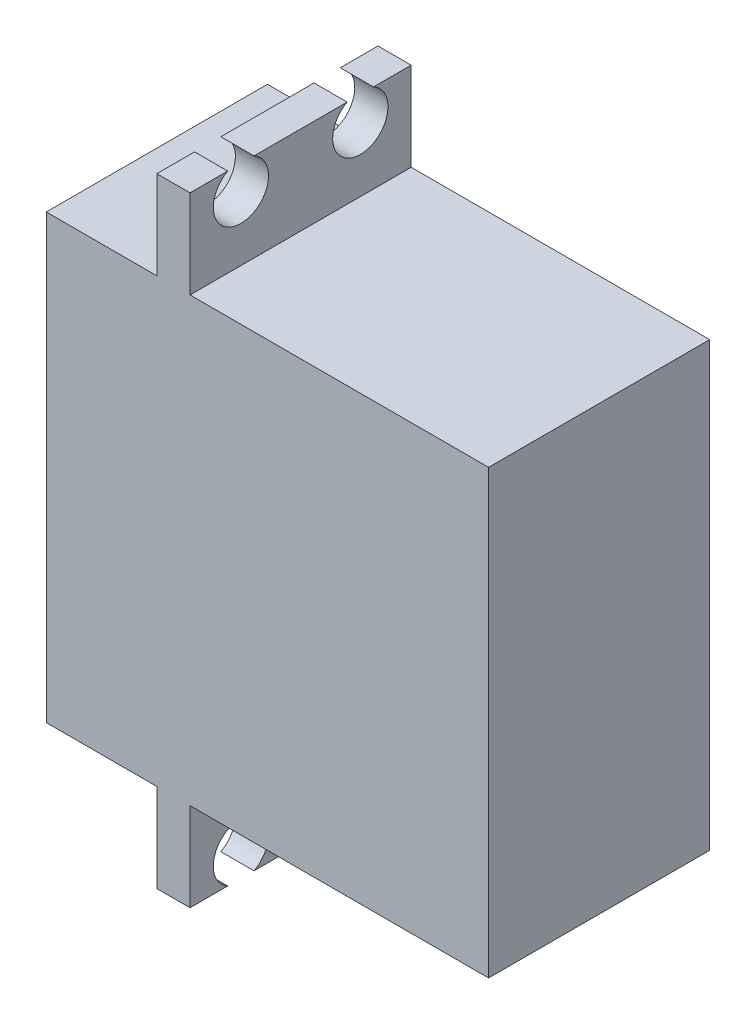
ISO-10303-21;
HEADER;
FILE_DESCRIPTION(('STEP AP214'),'2;1');
FILE_NAME('part.step','',(''),(''),'','','');
FILE_SCHEMA(('AUTOMOTIVE_DESIGN { 1 0 10303 214 1 1 1 1 }'));
ENDSEC;
DATA;
#1=APPLICATION_CONTEXT('core data for automotive mechanical design processes');
#2=APPLICATION_PROTOCOL_DEFINITION('international standard','automotive_design',2000,#1);
#3=PRODUCT_CONTEXT('',#1,'mechanical');
#4=PRODUCT('Part','Part','',(#3));
#5=PRODUCT_RELATED_PRODUCT_CATEGORY('part','',(#4));
#6=PRODUCT_DEFINITION_FORMATION('','',#4);
#7=PRODUCT_DEFINITION_CONTEXT('part definition',#1,'design');
#8=PRODUCT_DEFINITION('design','',#6,#7);
#9=PRODUCT_DEFINITION_SHAPE('','',#8);
#10=(LENGTH_UNIT() NAMED_UNIT(*) SI_UNIT(.MILLI.,.METRE.));
#11=(NAMED_UNIT(*) PLANE_ANGLE_UNIT() SI_UNIT($,.RADIAN.));
#12=(NAMED_UNIT(*) SI_UNIT($,.STERADIAN.) SOLID_ANGLE_UNIT());
#13=UNCERTAINTY_MEASURE_WITH_UNIT(LENGTH_MEASURE(1.E-05),#10,'distance_accuracy_value','');
#14=(GEOMETRIC_REPRESENTATION_CONTEXT(3) GLOBAL_UNCERTAINTY_ASSIGNED_CONTEXT((#13)) GLOBAL_UNIT_ASSIGNED_CONTEXT((#10,
#11,#12)) REPRESENTATION_CONTEXT('',''));
#15=CARTESIAN_POINT('',(0.,0.,0.));
#16=DIRECTION('',(0.,0.,1.));
#17=DIRECTION('',(1.,0.,0.));
#18=AXIS2_PLACEMENT_3D('',#15,#16,#17);
#19=CARTESIAN_POINT('',(0.,28.,0.));
#20=DIRECTION('',(0.,1.,0.));
#21=DIRECTION('',(0.,0.,1.));
#22=AXIS2_PLACEMENT_3D('',#19,#20,#21);
#23=PLANE('',#22);
#24=DIRECTION('',(-1.,0.,0.));
#25=VECTOR('',#24,1.);
#26=CARTESIAN_POINT('',(-2.,28.,3.41256579129621));
#27=LINE('',#26,#25);
#28=CARTESIAN_POINT('',(-7.,28.,3.41256579129621));
#29=VERTEX_POINT('',#28);
#30=CARTESIAN_POINT('',(-10.,28.,3.41256579129621));
#31=VERTEX_POINT('',#30);
#32=EDGE_CURVE('E42',#29,#31,#27,.T.);
#33=ORIENTED_EDGE('',*,*,#32,.F.);
#34=DIRECTION('',(0.,0.,-1.));
#35=VECTOR('',#34,1.);
#36=CARTESIAN_POINT('',(-7.,28.,0.));
#37=LINE('',#36,#35);
#38=CARTESIAN_POINT('',(-7.,28.,0.));
#39=VERTEX_POINT('',#38);
#40=EDGE_CURVE('E200',#29,#39,#37,.T.);
#41=ORIENTED_EDGE('',*,*,#40,.T.);
#42=DIRECTION('',(-1.,0.,0.));
#43=VECTOR('',#42,1.);
#44=CARTESIAN_POINT('',(-10.,28.,0.));
#45=LINE('',#44,#43);
#46=CARTESIAN_POINT('',(-10.,28.,0.));
#47=VERTEX_POINT('',#46);
#48=EDGE_CURVE('E204',#39,#47,#45,.T.);
#49=ORIENTED_EDGE('',*,*,#48,.T.);
#50=DIRECTION('',(0.,0.,1.));
#51=VECTOR('',#50,1.);
#52=CARTESIAN_POINT('',(-10.,28.,0.));
#53=LINE('',#52,#51);
#54=EDGE_CURVE('E190',#47,#31,#53,.T.);
#55=ORIENTED_EDGE('',*,*,#54,.T.);
#56=EDGE_LOOP('',(#33,#41,#49,#55));
#57=FACE_BOUND('',#56,.T.);
#58=ADVANCED_FACE('F34',(#57),#23,.T.);
#59=DIRECTION('',(-1.,0.,0.));
#60=VECTOR('',#59,1.);
#61=CARTESIAN_POINT('',(-2.,28.,5.78743420870379));
#62=LINE('',#61,#60);
#63=CARTESIAN_POINT('',(-10.,28.,5.78743420870379));
#64=VERTEX_POINT('',#63);
#65=CARTESIAN_POINT('',(-6.99999999999999,28.,5.78743420870379));
#66=VERTEX_POINT('',#65);
#67=EDGE_CURVE('E177',#64,#66,#62,.F.);
#68=ORIENTED_EDGE('',*,*,#67,.F.);
#69=CARTESIAN_POINT('',(-10.,28.,14.2125657912962));
#70=VERTEX_POINT('',#69);
#71=EDGE_CURVE('E184',#64,#70,#53,.T.);
#72=ORIENTED_EDGE('',*,*,#71,.T.);
#73=DIRECTION('',(-1.,0.,0.));
#74=VECTOR('',#73,1.);
#75=CARTESIAN_POINT('',(-2.,28.,14.2125657912962));
#76=LINE('',#75,#74);
#77=CARTESIAN_POINT('',(-7.,28.,14.2125657912962));
#78=VERTEX_POINT('',#77);
#79=EDGE_CURVE('E169',#78,#70,#76,.T.);
#80=ORIENTED_EDGE('',*,*,#79,.F.);
#81=EDGE_CURVE('E205',#78,#66,#37,.T.);
#82=ORIENTED_EDGE('',*,*,#81,.T.);
#83=EDGE_LOOP('',(#68,#72,#80,#82));
#84=FACE_BOUND('',#83,.T.);
#85=ADVANCED_FACE('F189',(#84),#23,.T.);
#86=CARTESIAN_POINT('',(0.,-28.,0.));
#87=DIRECTION('',(0.,-1.,0.));
#88=DIRECTION('',(0.,0.,-1.));
#89=AXIS2_PLACEMENT_3D('',#86,#87,#88);
#90=PLANE('',#89);
#91=DIRECTION('',(-1.,0.,0.));
#92=VECTOR('',#91,1.);
#93=CARTESIAN_POINT('',(-1.99999999999999,-28.,5.78743420870379));
#94=LINE('',#93,#92);
#95=CARTESIAN_POINT('',(-7.,-28.,5.78743420870379));
#96=VERTEX_POINT('',#95);
#97=CARTESIAN_POINT('',(-9.99999999999999,-28.,5.78743420870379));
#98=VERTEX_POINT('',#97);
#99=EDGE_CURVE('E266',#96,#98,#94,.T.);
#100=ORIENTED_EDGE('',*,*,#99,.F.);
#101=DIRECTION('',(0.,0.,1.));
#102=VECTOR('',#101,1.);
#103=CARTESIAN_POINT('',(-7.,-28.,20.));
#104=LINE('',#103,#102);
#105=CARTESIAN_POINT('',(-6.99999999999999,-28.,14.2125657912962));
#106=VERTEX_POINT('',#105);
#107=EDGE_CURVE('E324',#96,#106,#104,.T.);
#108=ORIENTED_EDGE('',*,*,#107,.T.);
#109=DIRECTION('',(-1.,0.,0.));
#110=VECTOR('',#109,1.);
#111=CARTESIAN_POINT('',(-1.99999999999999,-28.,14.2125657912962));
#112=LINE('',#111,#110);
#113=CARTESIAN_POINT('',(-9.99999999999999,-28.,14.2125657912962));
#114=VERTEX_POINT('',#113);
#115=EDGE_CURVE('E260',#114,#106,#112,.F.);
#116=ORIENTED_EDGE('',*,*,#115,.F.);
#117=DIRECTION('',(0.,0.,-1.));
#118=VECTOR('',#117,1.);
#119=CARTESIAN_POINT('',(-9.99999999999999,-28.,20.));
#120=LINE('',#119,#118);
#121=EDGE_CURVE('E316',#114,#98,#120,.T.);
#122=ORIENTED_EDGE('',*,*,#121,.T.);
#123=EDGE_LOOP('',(#100,#108,#116,#122));
#124=FACE_BOUND('',#123,.T.);
#125=ADVANCED_FACE('F374',(#124),#90,.T.);
#126=DIRECTION('',(-1.,0.,0.));
#127=VECTOR('',#126,1.);
#128=CARTESIAN_POINT('',(-1.99999999999999,-28.,16.5874342087038));
#129=LINE('',#128,#127);
#130=CARTESIAN_POINT('',(-7.,-28.,16.5874342087038));
#131=VERTEX_POINT('',#130);
#132=CARTESIAN_POINT('',(-9.99999999999999,-28.,16.5874342087038));
#133=VERTEX_POINT('',#132);
#134=EDGE_CURVE('E262',#131,#133,#129,.T.);
#135=ORIENTED_EDGE('',*,*,#134,.F.);
#136=CARTESIAN_POINT('',(-7.,-28.,20.));
#137=VERTEX_POINT('',#136);
#138=EDGE_CURVE('E319',#131,#137,#104,.T.);
#139=ORIENTED_EDGE('',*,*,#138,.T.);
#140=DIRECTION('',(-1.,0.,0.));
#141=VECTOR('',#140,1.);
#142=CARTESIAN_POINT('',(-9.99999999999999,-28.,20.));
#143=LINE('',#142,#141);
#144=CARTESIAN_POINT('',(-9.99999999999999,-28.,20.));
#145=VERTEX_POINT('',#144);
#146=EDGE_CURVE('E323',#137,#145,#143,.T.);
#147=ORIENTED_EDGE('',*,*,#146,.T.);
#148=EDGE_CURVE('E312',#145,#133,#120,.T.);
#149=ORIENTED_EDGE('',*,*,#148,.T.);
#150=EDGE_LOOP('',(#135,#139,#147,#149));
#151=FACE_BOUND('',#150,.T.);
#152=ADVANCED_FACE('F391',(#151),#90,.T.);
#153=CARTESIAN_POINT('',(-20.,-20.,20.));
#154=DIRECTION('',(0.,1.,0.));
#155=DIRECTION('',(0.,0.,1.));
#156=AXIS2_PLACEMENT_3D('',#153,#154,#155);
#157=PLANE('',#156);
#158=DIRECTION('',(0.,0.,-1.));
#159=VECTOR('',#158,1.);
#160=CARTESIAN_POINT('',(-9.99999999999999,-20.,20.));
#161=LINE('',#160,#159);
#162=CARTESIAN_POINT('',(-9.99999999999999,-20.,20.));
#163=VERTEX_POINT('',#162);
#164=CARTESIAN_POINT('',(-9.99999999999999,-20.,0.));
#165=VERTEX_POINT('',#164);
#166=EDGE_CURVE('E311',#163,#165,#161,.T.);
#167=ORIENTED_EDGE('',*,*,#166,.F.);
#168=DIRECTION('',(1.,0.,0.));
#169=VECTOR('',#168,1.);
#170=CARTESIAN_POINT('',(-20.,-20.,20.));
#171=LINE('',#170,#169);
#172=CARTESIAN_POINT('',(-20.,-20.,20.));
#173=VERTEX_POINT('',#172);
#174=EDGE_CURVE('E236',#173,#163,#171,.T.);
#175=ORIENTED_EDGE('',*,*,#174,.F.);
#176=DIRECTION('',(0.,0.,-1.));
#177=VECTOR('',#176,1.);
#178=CARTESIAN_POINT('',(-20.,-20.,20.));
#179=LINE('',#178,#177);
#180=CARTESIAN_POINT('',(-20.,-20.,0.));
#181=VERTEX_POINT('',#180);
#182=EDGE_CURVE('E251',#173,#181,#179,.T.);
#183=ORIENTED_EDGE('',*,*,#182,.T.);
#184=DIRECTION('',(1.,0.,0.));
#185=VECTOR('',#184,1.);
#186=CARTESIAN_POINT('',(-20.,-20.,0.));
#187=LINE('',#186,#185);
#188=EDGE_CURVE('E229',#181,#165,#187,.T.);
#189=ORIENTED_EDGE('',*,*,#188,.T.);
#190=EDGE_LOOP('',(#167,#175,#183,#189));
#191=FACE_BOUND('',#190,.T.);
#192=ADVANCED_FACE('F352',(#191),#157,.F.);
#193=DIRECTION('',(0.,0.,1.));
#194=VECTOR('',#193,1.);
#195=CARTESIAN_POINT('',(-7.,-20.,20.));
#196=LINE('',#195,#194);
#197=CARTESIAN_POINT('',(-7.,-20.,0.));
#198=VERTEX_POINT('',#197);
#199=CARTESIAN_POINT('',(-7.,-20.,20.));
#200=VERTEX_POINT('',#199);
#201=EDGE_CURVE('E329',#198,#200,#196,.T.);
#202=ORIENTED_EDGE('',*,*,#201,.F.);
#203=CARTESIAN_POINT('',(20.,-20.,0.));
#204=VERTEX_POINT('',#203);
#205=EDGE_CURVE('E247',#198,#204,#187,.T.);
#206=ORIENTED_EDGE('',*,*,#205,.T.);
#207=DIRECTION('',(0.,0.,-1.));
#208=VECTOR('',#207,1.);
#209=CARTESIAN_POINT('',(20.,-20.,20.));
#210=LINE('',#209,#208);
#211=CARTESIAN_POINT('',(20.,-20.,20.));
#212=VERTEX_POINT('',#211);
#213=EDGE_CURVE('E239',#212,#204,#210,.T.);
#214=ORIENTED_EDGE('',*,*,#213,.F.);
#215=EDGE_CURVE('E235',#200,#212,#171,.T.);
#216=ORIENTED_EDGE('',*,*,#215,.F.);
#217=EDGE_LOOP('',(#202,#206,#214,#216));
#218=FACE_BOUND('',#217,.T.);
#219=ADVANCED_FACE('F390',(#218),#157,.F.);
#220=CARTESIAN_POINT('',(-20.,20.,20.));
#221=DIRECTION('',(0.,-1.,0.));
#222=DIRECTION('',(0.,0.,-1.));
#223=AXIS2_PLACEMENT_3D('',#220,#221,#222);
#224=PLANE('',#223);
#225=DIRECTION('',(0.,0.,1.));
#226=VECTOR('',#225,1.);
#227=CARTESIAN_POINT('',(-10.,20.,0.));
#228=LINE('',#227,#226);
#229=CARTESIAN_POINT('',(-10.,20.,0.));
#230=VERTEX_POINT('',#229);
#231=CARTESIAN_POINT('',(-10.,20.,20.));
#232=VERTEX_POINT('',#231);
#233=EDGE_CURVE('E208',#230,#232,#228,.T.);
#234=ORIENTED_EDGE('',*,*,#233,.F.);
#235=DIRECTION('',(-1.,0.,0.));
#236=VECTOR('',#235,1.);
#237=CARTESIAN_POINT('',(-20.,20.,0.));
#238=LINE('',#237,#236);
#239=CARTESIAN_POINT('',(-20.,20.,0.));
#240=VERTEX_POINT('',#239);
#241=EDGE_CURVE('E242',#230,#240,#238,.T.);
#242=ORIENTED_EDGE('',*,*,#241,.T.);
#243=DIRECTION('',(0.,0.,-1.));
#244=VECTOR('',#243,1.);
#245=CARTESIAN_POINT('',(-20.,20.,20.));
#246=LINE('',#245,#244);
#247=CARTESIAN_POINT('',(-20.,20.,20.));
#248=VERTEX_POINT('',#247);
#249=EDGE_CURVE('E254',#248,#240,#246,.T.);
#250=ORIENTED_EDGE('',*,*,#249,.F.);
#251=DIRECTION('',(-1.,0.,0.));
#252=VECTOR('',#251,1.);
#253=CARTESIAN_POINT('',(-20.,20.,20.));
#254=LINE('',#253,#252);
#255=EDGE_CURVE('E228',#232,#248,#254,.T.);
#256=ORIENTED_EDGE('',*,*,#255,.F.);
#257=EDGE_LOOP('',(#234,#242,#250,#256));
#258=FACE_BOUND('',#257,.T.);
#259=ADVANCED_FACE('F286',(#258),#224,.F.);
#260=DIRECTION('',(0.,0.,-1.));
#261=VECTOR('',#260,1.);
#262=CARTESIAN_POINT('',(-7.,20.,0.));
#263=LINE('',#262,#261);
#264=CARTESIAN_POINT('',(-7.,20.,20.));
#265=VERTEX_POINT('',#264);
#266=CARTESIAN_POINT('',(-7.,20.,0.));
#267=VERTEX_POINT('',#266);
#268=EDGE_CURVE('E194',#265,#267,#263,.T.);
#269=ORIENTED_EDGE('',*,*,#268,.F.);
#270=CARTESIAN_POINT('',(20.,20.,20.));
#271=VERTEX_POINT('',#270);
#272=EDGE_CURVE('E230',#271,#265,#254,.T.);
#273=ORIENTED_EDGE('',*,*,#272,.F.);
#274=DIRECTION('',(0.,0.,-1.));
#275=VECTOR('',#274,1.);
#276=CARTESIAN_POINT('',(20.,20.,20.));
#277=LINE('',#276,#275);
#278=CARTESIAN_POINT('',(20.,20.,0.));
#279=VERTEX_POINT('',#278);
#280=EDGE_CURVE('E257',#271,#279,#277,.T.);
#281=ORIENTED_EDGE('',*,*,#280,.T.);
#282=EDGE_CURVE('E243',#279,#267,#238,.T.);
#283=ORIENTED_EDGE('',*,*,#282,.T.);
#284=EDGE_LOOP('',(#269,#273,#281,#283));
#285=FACE_BOUND('',#284,.T.);
#286=ADVANCED_FACE('F365',(#285),#224,.F.);
#287=CARTESIAN_POINT('',(20.,-20.,20.));
#288=DIRECTION('',(-1.,0.,0.));
#289=DIRECTION('',(0.,0.,1.));
#290=AXIS2_PLACEMENT_3D('',#287,#288,#289);
#291=PLANE('',#290);
#292=DIRECTION('',(0.,1.,0.));
#293=VECTOR('',#292,1.);
#294=CARTESIAN_POINT('',(20.,-20.,0.));
#295=LINE('',#294,#293);
#296=EDGE_CURVE('E224',#204,#279,#295,.T.);
#297=ORIENTED_EDGE('',*,*,#296,.T.);
#298=ORIENTED_EDGE('',*,*,#280,.F.);
#299=DIRECTION('',(0.,1.,0.));
#300=VECTOR('',#299,1.);
#301=CARTESIAN_POINT('',(20.,-20.,20.));
#302=LINE('',#301,#300);
#303=EDGE_CURVE('E225',#212,#271,#302,.T.);
#304=ORIENTED_EDGE('',*,*,#303,.F.);
#305=ORIENTED_EDGE('',*,*,#213,.T.);
#306=EDGE_LOOP('',(#297,#298,#304,#305));
#307=FACE_BOUND('',#306,.T.);
#308=ADVANCED_FACE('F36',(#307),#291,.F.);
#309=CARTESIAN_POINT('',(-20.,-20.,20.));
#310=DIRECTION('',(1.,0.,0.));
#311=DIRECTION('',(0.,0.,-1.));
#312=AXIS2_PLACEMENT_3D('',#309,#310,#311);
#313=PLANE('',#312);
#314=CARTESIAN_POINT('',(-20.,10.,10.));
#315=DIRECTION('',(1.,0.,0.));
#316=DIRECTION('',(0.,0.,-1.));
#317=AXIS2_PLACEMENT_3D('',#314,#315,#316);
#318=CIRCLE('',#317,2.95);
#319=CARTESIAN_POINT('',(-20.,10.,7.05));
#320=VERTEX_POINT('',#319);
#321=EDGE_CURVE('E11',#320,#320,#318,.F.);
#322=ORIENTED_EDGE('',*,*,#321,.F.);
#323=EDGE_LOOP('',(#322));
#324=FACE_BOUND('',#323,.T.);
#325=DIRECTION('',(0.,-1.,0.));
#326=VECTOR('',#325,1.);
#327=CARTESIAN_POINT('',(-20.,-20.,0.));
#328=LINE('',#327,#326);
#329=EDGE_CURVE('E245',#240,#181,#328,.T.);
#330=ORIENTED_EDGE('',*,*,#329,.T.);
#331=ORIENTED_EDGE('',*,*,#182,.F.);
#332=DIRECTION('',(0.,-1.,0.));
#333=VECTOR('',#332,1.);
#334=CARTESIAN_POINT('',(-20.,-20.,20.));
#335=LINE('',#334,#333);
#336=EDGE_CURVE('E233',#248,#173,#335,.T.);
#337=ORIENTED_EDGE('',*,*,#336,.F.);
#338=ORIENTED_EDGE('',*,*,#249,.T.);
#339=EDGE_LOOP('',(#330,#331,#337,#338));
#340=FACE_BOUND('',#339,.T.);
#341=ADVANCED_FACE('F356',(#324,#340),#313,.F.);
#342=CARTESIAN_POINT('',(0.,0.,20.));
#343=DIRECTION('',(0.,0.,-1.));
#344=DIRECTION('',(-1.,0.,0.));
#345=AXIS2_PLACEMENT_3D('',#342,#343,#344);
#346=PLANE('',#345);
#347=ORIENTED_EDGE('',*,*,#303,.T.);
#348=ORIENTED_EDGE('',*,*,#272,.T.);
#349=DIRECTION('',(0.,-1.,0.));
#350=VECTOR('',#349,1.);
#351=CARTESIAN_POINT('',(-6.99999999999999,28.,20.));
#352=LINE('',#351,#350);
#353=CARTESIAN_POINT('',(-6.99999999999999,28.,20.));
#354=VERTEX_POINT('',#353);
#355=EDGE_CURVE('E218',#354,#265,#352,.T.);
#356=ORIENTED_EDGE('',*,*,#355,.F.);
#357=DIRECTION('',(1.,0.,0.));
#358=VECTOR('',#357,1.);
#359=CARTESIAN_POINT('',(-10.,28.,20.));
#360=LINE('',#359,#358);
#361=CARTESIAN_POINT('',(-10.,28.,20.));
#362=VERTEX_POINT('',#361);
#363=EDGE_CURVE('E193',#362,#354,#360,.T.);
#364=ORIENTED_EDGE('',*,*,#363,.F.);
#365=DIRECTION('',(0.,-1.,0.));
#366=VECTOR('',#365,1.);
#367=CARTESIAN_POINT('',(-10.,28.,20.));
#368=LINE('',#367,#366);
#369=EDGE_CURVE('E221',#362,#232,#368,.T.);
#370=ORIENTED_EDGE('',*,*,#369,.T.);
#371=ORIENTED_EDGE('',*,*,#255,.T.);
#372=ORIENTED_EDGE('',*,*,#336,.T.);
#373=ORIENTED_EDGE('',*,*,#174,.T.);
#374=DIRECTION('',(0.,1.,0.));
#375=VECTOR('',#374,1.);
#376=CARTESIAN_POINT('',(-9.99999999999999,-28.,20.));
#377=LINE('',#376,#375);
#378=EDGE_CURVE('E326',#145,#163,#377,.T.);
#379=ORIENTED_EDGE('',*,*,#378,.F.);
#380=ORIENTED_EDGE('',*,*,#146,.F.);
#381=DIRECTION('',(0.,1.,0.));
#382=VECTOR('',#381,1.);
#383=CARTESIAN_POINT('',(-7.,-28.,20.));
#384=LINE('',#383,#382);
#385=EDGE_CURVE('E334',#137,#200,#384,.T.);
#386=ORIENTED_EDGE('',*,*,#385,.T.);
#387=ORIENTED_EDGE('',*,*,#215,.T.);
#388=EDGE_LOOP('',(#347,#348,#356,#364,#370,#371,#372,#373,#379,#380,#386,#387));
#389=FACE_BOUND('',#388,.T.);
#390=ADVANCED_FACE('F291',(#389),#346,.F.);
#391=CARTESIAN_POINT('',(0.,0.,0.));
#392=DIRECTION('',(0.,0.,-1.));
#393=DIRECTION('',(-1.,0.,0.));
#394=AXIS2_PLACEMENT_3D('',#391,#392,#393);
#395=PLANE('',#394);
#396=ORIENTED_EDGE('',*,*,#296,.F.);
#397=ORIENTED_EDGE('',*,*,#205,.F.);
#398=DIRECTION('',(0.,1.,0.));
#399=VECTOR('',#398,1.);
#400=CARTESIAN_POINT('',(-6.99999999999999,-28.,0.));
#401=LINE('',#400,#399);
#402=CARTESIAN_POINT('',(-6.99999999999999,-28.,0.));
#403=VERTEX_POINT('',#402);
#404=EDGE_CURVE('E336',#403,#198,#401,.T.);
#405=ORIENTED_EDGE('',*,*,#404,.F.);
#406=DIRECTION('',(1.,0.,0.));
#407=VECTOR('',#406,1.);
#408=CARTESIAN_POINT('',(-9.99999999999999,-28.,0.));
#409=LINE('',#408,#407);
#410=CARTESIAN_POINT('',(-9.99999999999999,-28.,0.));
#411=VERTEX_POINT('',#410);
#412=EDGE_CURVE('E315',#411,#403,#409,.T.);
#413=ORIENTED_EDGE('',*,*,#412,.F.);
#414=DIRECTION('',(0.,1.,0.));
#415=VECTOR('',#414,1.);
#416=CARTESIAN_POINT('',(-9.99999999999999,-28.,0.));
#417=LINE('',#416,#415);
#418=EDGE_CURVE('E197',#411,#165,#417,.T.);
#419=ORIENTED_EDGE('',*,*,#418,.T.);
#420=ORIENTED_EDGE('',*,*,#188,.F.);
#421=ORIENTED_EDGE('',*,*,#329,.F.);
#422=ORIENTED_EDGE('',*,*,#241,.F.);
#423=DIRECTION('',(0.,-1.,0.));
#424=VECTOR('',#423,1.);
#425=CARTESIAN_POINT('',(-10.,28.,0.));
#426=LINE('',#425,#424);
#427=EDGE_CURVE('E207',#47,#230,#426,.T.);
#428=ORIENTED_EDGE('',*,*,#427,.F.);
#429=ORIENTED_EDGE('',*,*,#48,.F.);
#430=DIRECTION('',(0.,-1.,0.));
#431=VECTOR('',#430,1.);
#432=CARTESIAN_POINT('',(-7.,28.,0.));
#433=LINE('',#432,#431);
#434=EDGE_CURVE('E215',#39,#267,#433,.T.);
#435=ORIENTED_EDGE('',*,*,#434,.T.);
#436=ORIENTED_EDGE('',*,*,#282,.F.);
#437=EDGE_LOOP('',(#396,#397,#405,#413,#419,#420,#421,#422,#428,#429,#435,#436));
#438=FACE_BOUND('',#437,.T.);
#439=ADVANCED_FACE('F283',(#438),#395,.T.);
#440=CARTESIAN_POINT('',(-10.,28.,0.));
#441=DIRECTION('',(1.,0.,0.));
#442=DIRECTION('',(0.,0.,-1.));
#443=AXIS2_PLACEMENT_3D('',#440,#441,#442);
#444=PLANE('',#443);
#445=ORIENTED_EDGE('',*,*,#71,.F.);
#446=CARTESIAN_POINT('',(-10.,25.8,4.6));
#447=DIRECTION('',(-1.,0.,0.));
#448=DIRECTION('',(0.,0.,1.));
#449=AXIS2_PLACEMENT_3D('',#446,#447,#448);
#450=CIRCLE('',#449,2.5);
#451=EDGE_CURVE('E57',#31,#64,#450,.T.);
#452=ORIENTED_EDGE('',*,*,#451,.F.);
#453=ORIENTED_EDGE('',*,*,#54,.F.);
#454=ORIENTED_EDGE('',*,*,#427,.T.);
#455=ORIENTED_EDGE('',*,*,#233,.T.);
#456=ORIENTED_EDGE('',*,*,#369,.F.);
#457=CARTESIAN_POINT('',(-10.,28.,16.5874342087038));
#458=VERTEX_POINT('',#457);
#459=EDGE_CURVE('E186',#458,#362,#53,.T.);
#460=ORIENTED_EDGE('',*,*,#459,.F.);
#461=CARTESIAN_POINT('',(-10.,25.8,15.4));
#462=DIRECTION('',(-1.,0.,0.));
#463=DIRECTION('',(0.,0.,1.));
#464=AXIS2_PLACEMENT_3D('',#461,#462,#463);
#465=CIRCLE('',#464,2.5);
#466=EDGE_CURVE('E49',#70,#458,#465,.T.);
#467=ORIENTED_EDGE('',*,*,#466,.F.);
#468=EDGE_LOOP('',(#445,#452,#453,#454,#455,#456,#460,#467));
#469=FACE_BOUND('',#468,.T.);
#470=ADVANCED_FACE('F183',(#469),#444,.F.);
#471=CARTESIAN_POINT('',(-7.,28.,0.));
#472=DIRECTION('',(-1.,0.,0.));
#473=DIRECTION('',(0.,0.,1.));
#474=AXIS2_PLACEMENT_3D('',#471,#472,#473);
#475=PLANE('',#474);
#476=ORIENTED_EDGE('',*,*,#40,.F.);
#477=CARTESIAN_POINT('',(-7.,25.8,4.6));
#478=DIRECTION('',(-1.,0.,0.));
#479=DIRECTION('',(0.,0.,1.));
#480=AXIS2_PLACEMENT_3D('',#477,#478,#479);
#481=CIRCLE('',#480,2.5);
#482=EDGE_CURVE('E272',#29,#66,#481,.T.);
#483=ORIENTED_EDGE('',*,*,#482,.T.);
#484=ORIENTED_EDGE('',*,*,#81,.F.);
#485=CARTESIAN_POINT('',(-7.,25.8,15.4));
#486=DIRECTION('',(-1.,0.,0.));
#487=DIRECTION('',(0.,0.,1.));
#488=AXIS2_PLACEMENT_3D('',#485,#486,#487);
#489=CIRCLE('',#488,2.5);
#490=CARTESIAN_POINT('',(-6.99999999999999,28.,16.5874342087038));
#491=VERTEX_POINT('',#490);
#492=EDGE_CURVE('E172',#78,#491,#489,.T.);
#493=ORIENTED_EDGE('',*,*,#492,.T.);
#494=EDGE_CURVE('E201',#354,#491,#37,.T.);
#495=ORIENTED_EDGE('',*,*,#494,.F.);
#496=ORIENTED_EDGE('',*,*,#355,.T.);
#497=ORIENTED_EDGE('',*,*,#268,.T.);
#498=ORIENTED_EDGE('',*,*,#434,.F.);
#499=EDGE_LOOP('',(#476,#483,#484,#493,#495,#496,#497,#498));
#500=FACE_BOUND('',#499,.T.);
#501=ADVANCED_FACE('F297',(#500),#475,.F.);
#502=DIRECTION('',(-1.,0.,0.));
#503=VECTOR('',#502,1.);
#504=CARTESIAN_POINT('',(-2.,28.,16.5874342087038));
#505=LINE('',#504,#503);
#506=EDGE_CURVE('E178',#458,#491,#505,.F.);
#507=ORIENTED_EDGE('',*,*,#506,.F.);
#508=ORIENTED_EDGE('',*,*,#459,.T.);
#509=ORIENTED_EDGE('',*,*,#363,.T.);
#510=ORIENTED_EDGE('',*,*,#494,.T.);
#511=EDGE_LOOP('',(#507,#508,#509,#510));
#512=FACE_BOUND('',#511,.T.);
#513=ADVANCED_FACE('F295',(#512),#23,.T.);
#514=CARTESIAN_POINT('',(-9.99999999999999,-28.,20.));
#515=DIRECTION('',(1.,0.,0.));
#516=DIRECTION('',(0.,0.,-1.));
#517=AXIS2_PLACEMENT_3D('',#514,#515,#516);
#518=PLANE('',#517);
#519=CARTESIAN_POINT('',(-9.99999999999999,-28.,3.41256579129621));
#520=VERTEX_POINT('',#519);
#521=EDGE_CURVE('E317',#520,#411,#120,.T.);
#522=ORIENTED_EDGE('',*,*,#521,.F.);
#523=CARTESIAN_POINT('',(-9.99999999999999,-25.8,4.6));
#524=DIRECTION('',(-1.,0.,0.));
#525=DIRECTION('',(0.,0.,1.));
#526=AXIS2_PLACEMENT_3D('',#523,#524,#525);
#527=CIRCLE('',#526,2.5);
#528=EDGE_CURVE('E302',#98,#520,#527,.T.);
#529=ORIENTED_EDGE('',*,*,#528,.F.);
#530=ORIENTED_EDGE('',*,*,#121,.F.);
#531=CARTESIAN_POINT('',(-9.99999999999999,-25.8,15.4));
#532=DIRECTION('',(-1.,0.,0.));
#533=DIRECTION('',(0.,0.,1.));
#534=AXIS2_PLACEMENT_3D('',#531,#532,#533);
#535=CIRCLE('',#534,2.5);
#536=EDGE_CURVE('E299',#133,#114,#535,.T.);
#537=ORIENTED_EDGE('',*,*,#536,.F.);
#538=ORIENTED_EDGE('',*,*,#148,.F.);
#539=ORIENTED_EDGE('',*,*,#378,.T.);
#540=ORIENTED_EDGE('',*,*,#166,.T.);
#541=ORIENTED_EDGE('',*,*,#418,.F.);
#542=EDGE_LOOP('',(#522,#529,#530,#537,#538,#539,#540,#541));
#543=FACE_BOUND('',#542,.T.);
#544=ADVANCED_FACE('F347',(#543),#518,.F.);
#545=CARTESIAN_POINT('',(-7.,-28.,20.));
#546=DIRECTION('',(-1.,0.,0.));
#547=DIRECTION('',(0.,0.,1.));
#548=AXIS2_PLACEMENT_3D('',#545,#546,#547);
#549=PLANE('',#548);
#550=ORIENTED_EDGE('',*,*,#107,.F.);
#551=CARTESIAN_POINT('',(-7.,-25.8,4.6));
#552=DIRECTION('',(-1.,0.,0.));
#553=DIRECTION('',(0.,0.,1.));
#554=AXIS2_PLACEMENT_3D('',#551,#552,#553);
#555=CIRCLE('',#554,2.5);
#556=CARTESIAN_POINT('',(-6.99999999999999,-28.,3.41256579129621));
#557=VERTEX_POINT('',#556);
#558=EDGE_CURVE('E308',#96,#557,#555,.T.);
#559=ORIENTED_EDGE('',*,*,#558,.T.);
#560=EDGE_CURVE('E320',#403,#557,#104,.T.);
#561=ORIENTED_EDGE('',*,*,#560,.F.);
#562=ORIENTED_EDGE('',*,*,#404,.T.);
#563=ORIENTED_EDGE('',*,*,#201,.T.);
#564=ORIENTED_EDGE('',*,*,#385,.F.);
#565=ORIENTED_EDGE('',*,*,#138,.F.);
#566=CARTESIAN_POINT('',(-7.,-25.8,15.4));
#567=DIRECTION('',(-1.,0.,0.));
#568=DIRECTION('',(0.,0.,1.));
#569=AXIS2_PLACEMENT_3D('',#566,#567,#568);
#570=CIRCLE('',#569,2.5);
#571=EDGE_CURVE('E304',#131,#106,#570,.T.);
#572=ORIENTED_EDGE('',*,*,#571,.T.);
#573=EDGE_LOOP('',(#550,#559,#561,#562,#563,#564,#565,#572));
#574=FACE_BOUND('',#573,.T.);
#575=ADVANCED_FACE('F382',(#574),#549,.F.);
#576=DIRECTION('',(-1.,0.,0.));
#577=VECTOR('',#576,1.);
#578=CARTESIAN_POINT('',(-1.99999999999999,-28.,3.41256579129621));
#579=LINE('',#578,#577);
#580=EDGE_CURVE('E264',#520,#557,#579,.F.);
#581=ORIENTED_EDGE('',*,*,#580,.F.);
#582=ORIENTED_EDGE('',*,*,#521,.T.);
#583=ORIENTED_EDGE('',*,*,#412,.T.);
#584=ORIENTED_EDGE('',*,*,#560,.T.);
#585=EDGE_LOOP('',(#581,#582,#583,#584));
#586=FACE_BOUND('',#585,.T.);
#587=ADVANCED_FACE('F399',(#586),#90,.T.);
#588=CARTESIAN_POINT('',(-1.99999999999999,-25.8,15.4));
#589=DIRECTION('',(-1.,0.,0.));
#590=DIRECTION('',(0.,0.,1.));
#591=AXIS2_PLACEMENT_3D('',#588,#589,#590);
#592=CYLINDRICAL_SURFACE('',#591,2.5);
#593=ORIENTED_EDGE('',*,*,#134,.T.);
#594=ORIENTED_EDGE('',*,*,#536,.T.);
#595=ORIENTED_EDGE('',*,*,#115,.T.);
#596=ORIENTED_EDGE('',*,*,#571,.F.);
#597=EDGE_LOOP('',(#593,#594,#595,#596));
#598=FACE_BOUND('',#597,.T.);
#599=ADVANCED_FACE('F408',(#598),#592,.F.);
#600=CARTESIAN_POINT('',(-1.99999999999999,-25.8,4.6));
#601=DIRECTION('',(-1.,0.,0.));
#602=DIRECTION('',(0.,0.,1.));
#603=AXIS2_PLACEMENT_3D('',#600,#601,#602);
#604=CYLINDRICAL_SURFACE('',#603,2.5);
#605=ORIENTED_EDGE('',*,*,#99,.T.);
#606=ORIENTED_EDGE('',*,*,#528,.T.);
#607=ORIENTED_EDGE('',*,*,#580,.T.);
#608=ORIENTED_EDGE('',*,*,#558,.F.);
#609=EDGE_LOOP('',(#605,#606,#607,#608));
#610=FACE_BOUND('',#609,.T.);
#611=ADVANCED_FACE('F414',(#610),#604,.F.);
#612=CARTESIAN_POINT('',(-2.,25.8,15.4));
#613=DIRECTION('',(-1.,0.,0.));
#614=DIRECTION('',(0.,0.,1.));
#615=AXIS2_PLACEMENT_3D('',#612,#613,#614);
#616=CYLINDRICAL_SURFACE('',#615,2.5);
#617=ORIENTED_EDGE('',*,*,#79,.T.);
#618=ORIENTED_EDGE('',*,*,#466,.T.);
#619=ORIENTED_EDGE('',*,*,#506,.T.);
#620=ORIENTED_EDGE('',*,*,#492,.F.);
#621=EDGE_LOOP('',(#617,#618,#619,#620));
#622=FACE_BOUND('',#621,.T.);
#623=ADVANCED_FACE('F170',(#622),#616,.F.);
#624=CARTESIAN_POINT('',(-2.,25.8,4.6));
#625=DIRECTION('',(-1.,0.,0.));
#626=DIRECTION('',(0.,0.,1.));
#627=AXIS2_PLACEMENT_3D('',#624,#625,#626);
#628=CYLINDRICAL_SURFACE('',#627,2.5);
#629=ORIENTED_EDGE('',*,*,#32,.T.);
#630=ORIENTED_EDGE('',*,*,#451,.T.);
#631=ORIENTED_EDGE('',*,*,#67,.T.);
#632=ORIENTED_EDGE('',*,*,#482,.F.);
#633=EDGE_LOOP('',(#629,#630,#631,#632));
#634=FACE_BOUND('',#633,.T.);
#635=ADVANCED_FACE('F270',(#634),#628,.F.);
#636=CARTESIAN_POINT('',(-25.,10.,10.));
#637=DIRECTION('',(1.,0.,0.));
#638=DIRECTION('',(0.,0.,-1.));
#639=AXIS2_PLACEMENT_3D('',#636,#637,#638);
#640=CYLINDRICAL_SURFACE('',#639,2.95);
#641=CARTESIAN_POINT('',(-25.,10.,10.));
#642=DIRECTION('',(-1.,0.,0.));
#643=DIRECTION('',(0.,0.,1.));
#644=AXIS2_PLACEMENT_3D('',#641,#642,#643);
#645=CIRCLE('',#644,2.95);
#646=CARTESIAN_POINT('',(-25.,10.,12.95));
#647=VERTEX_POINT('',#646);
#648=EDGE_CURVE('E187',#647,#647,#645,.T.);
#649=ORIENTED_EDGE('',*,*,#648,.F.);
#650=EDGE_LOOP('',(#649));
#651=FACE_BOUND('',#650,.T.);
#652=ORIENTED_EDGE('',*,*,#321,.T.);
#653=EDGE_LOOP('',(#652));
#654=FACE_BOUND('',#653,.T.);
#655=ADVANCED_FACE('F540',(#651,#654),#640,.T.);
#656=CARTESIAN_POINT('',(-25.,10.,10.));
#657=DIRECTION('',(-1.,0.,0.));
#658=DIRECTION('',(0.,0.,1.));
#659=AXIS2_PLACEMENT_3D('',#656,#657,#658);
#660=PLANE('',#659);
#661=ORIENTED_EDGE('',*,*,#648,.T.);
#662=EDGE_LOOP('',(#661));
#663=FACE_BOUND('',#662,.T.);
#664=ADVANCED_FACE('F556',(#663),#660,.T.);
#665=CLOSED_SHELL('',(#58,#85,#125,#152,#192,#219,#259,#286,#308,#341,#390,#439,#470,#501,#513,
#544,#575,#587,#599,#611,#623,#635,#655,#664));
#666=MANIFOLD_SOLID_BREP('B2',#665);
#667=ADVANCED_BREP_SHAPE_REPRESENTATION('',(#18,#666),#14);
#668=SHAPE_DEFINITION_REPRESENTATION(#9,#667);
ENDSEC;
END-ISO-10303-21;
